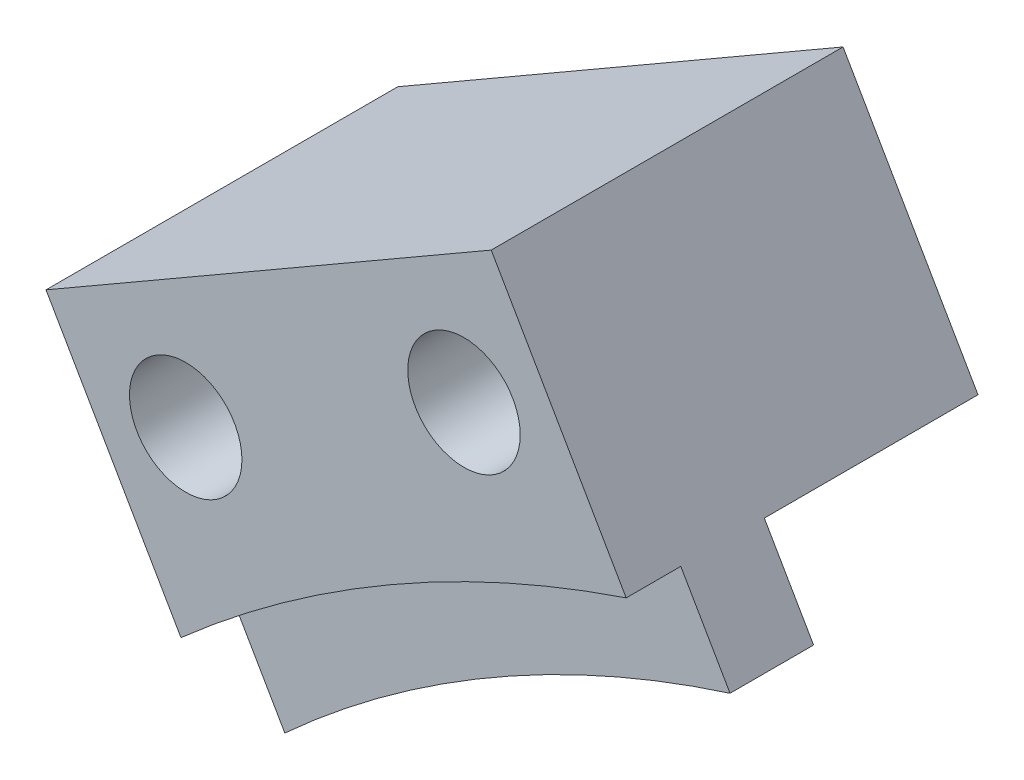
ISO-10303-21;
HEADER;
FILE_DESCRIPTION(('STEP AP214'),'2;1');
FILE_NAME('part.step','',(''),(''),'','','');
FILE_SCHEMA(('AUTOMOTIVE_DESIGN { 1 0 10303 214 1 1 1 1 }'));
ENDSEC;
DATA;
#1=APPLICATION_CONTEXT('core data for automotive mechanical design processes');
#2=APPLICATION_PROTOCOL_DEFINITION('international standard','automotive_design',2000,#1);
#3=PRODUCT_CONTEXT('',#1,'mechanical');
#4=PRODUCT('Part','Part','',(#3));
#5=PRODUCT_RELATED_PRODUCT_CATEGORY('part','',(#4));
#6=PRODUCT_DEFINITION_FORMATION('','',#4);
#7=PRODUCT_DEFINITION_CONTEXT('part definition',#1,'design');
#8=PRODUCT_DEFINITION('design','',#6,#7);
#9=PRODUCT_DEFINITION_SHAPE('','',#8);
#10=(LENGTH_UNIT() NAMED_UNIT(*) SI_UNIT(.MILLI.,.METRE.));
#11=(NAMED_UNIT(*) PLANE_ANGLE_UNIT() SI_UNIT($,.RADIAN.));
#12=(NAMED_UNIT(*) SI_UNIT($,.STERADIAN.) SOLID_ANGLE_UNIT());
#13=UNCERTAINTY_MEASURE_WITH_UNIT(LENGTH_MEASURE(1.E-05),#10,'distance_accuracy_value','');
#14=(GEOMETRIC_REPRESENTATION_CONTEXT(3) GLOBAL_UNCERTAINTY_ASSIGNED_CONTEXT((#13)) GLOBAL_UNIT_ASSIGNED_CONTEXT((#10,
#11,#12)) REPRESENTATION_CONTEXT('',''));
#15=CARTESIAN_POINT('',(0.,0.,0.));
#16=DIRECTION('',(0.,0.,1.));
#17=DIRECTION('',(1.,0.,0.));
#18=AXIS2_PLACEMENT_3D('',#15,#16,#17);
#19=CARTESIAN_POINT('',(-26.58012701892,36.038130468408,46.));
#20=DIRECTION('',(0.,0.,1.));
#21=DIRECTION('',(-0.50000000000019,0.866025403784329,0.));
#22=AXIS2_PLACEMENT_3D('',#19,#20,#21);
#23=CYLINDRICAL_SURFACE('',#22,1.75);
#24=DIRECTION('',(0.,0.,1.));
#25=VECTOR('',#24,1.);
#26=CARTESIAN_POINT('',(-27.45512701892,37.55367492503,46.));
#27=LINE('',#26,#25);
#28=CARTESIAN_POINT('',(-27.45512701892,37.55367492503,46.05));
#29=VERTEX_POINT('',#28);
#30=CARTESIAN_POINT('',(-27.45512701892,37.55367492503,57.));
#31=VERTEX_POINT('',#30);
#32=EDGE_CURVE('E10',#29,#31,#27,.T.);
#33=ORIENTED_EDGE('',*,*,#32,.F.);
#34=CARTESIAN_POINT('',(-26.58012701892,36.038130468408,46.05));
#35=DIRECTION('',(0.,0.,1.));
#36=DIRECTION('',(-0.50000000000019,0.866025403784329,0.));
#37=AXIS2_PLACEMENT_3D('',#34,#35,#36);
#38=CIRCLE('',#37,1.75);
#39=EDGE_CURVE('E166',#29,#29,#38,.T.);
#40=ORIENTED_EDGE('',*,*,#39,.F.);
#41=ORIENTED_EDGE('',*,*,#32,.T.);
#42=CARTESIAN_POINT('',(-26.58012701892,36.038130468408,57.));
#43=DIRECTION('',(0.,0.,1.));
#44=DIRECTION('',(-0.50000000000019,0.866025403784329,0.));
#45=AXIS2_PLACEMENT_3D('',#42,#43,#44);
#46=CIRCLE('',#45,1.75);
#47=EDGE_CURVE('E226',#31,#31,#46,.T.);
#48=ORIENTED_EDGE('',*,*,#47,.T.);
#49=EDGE_LOOP('',(#33,#40,#41,#48));
#50=FACE_BOUND('',#49,.T.);
#51=ADVANCED_FACE('F15',(#50),#23,.F.);
#52=CARTESIAN_POINT('',(-17.91987298107,41.038130468408,46.));
#53=DIRECTION('',(0.,0.,1.));
#54=DIRECTION('',(-0.50000000000019,0.866025403784329,0.));
#55=AXIS2_PLACEMENT_3D('',#52,#53,#54);
#56=CYLINDRICAL_SURFACE('',#55,1.75);
#57=DIRECTION('',(0.,0.,1.));
#58=VECTOR('',#57,1.);
#59=CARTESIAN_POINT('',(-18.79487298107,42.55367492503,46.));
#60=LINE('',#59,#58);
#61=CARTESIAN_POINT('',(-18.79487298107,42.55367492503,46.05));
#62=VERTEX_POINT('',#61);
#63=CARTESIAN_POINT('',(-18.79487298107,42.55367492503,57.));
#64=VERTEX_POINT('',#63);
#65=EDGE_CURVE('E24',#62,#64,#60,.T.);
#66=ORIENTED_EDGE('',*,*,#65,.F.);
#67=CARTESIAN_POINT('',(-17.91987298107,41.038130468408,46.05));
#68=DIRECTION('',(0.,0.,1.));
#69=DIRECTION('',(-0.50000000000019,0.866025403784329,0.));
#70=AXIS2_PLACEMENT_3D('',#67,#68,#69);
#71=CIRCLE('',#70,1.75);
#72=EDGE_CURVE('E171',#62,#62,#71,.T.);
#73=ORIENTED_EDGE('',*,*,#72,.F.);
#74=ORIENTED_EDGE('',*,*,#65,.T.);
#75=CARTESIAN_POINT('',(-17.91987298107,41.038130468408,57.));
#76=DIRECTION('',(0.,0.,1.));
#77=DIRECTION('',(-0.50000000000019,0.866025403784329,0.));
#78=AXIS2_PLACEMENT_3D('',#75,#76,#77);
#79=CIRCLE('',#78,1.75);
#80=EDGE_CURVE('E223',#64,#64,#79,.T.);
#81=ORIENTED_EDGE('',*,*,#80,.T.);
#82=EDGE_LOOP('',(#66,#73,#74,#81));
#83=FACE_BOUND('',#82,.T.);
#84=ADVANCED_FACE('F17',(#83),#56,.F.);
#85=CARTESIAN_POINT('',(-25.92820323027,28.908965343809,46.05));
#86=DIRECTION('',(-0.866025403784329,-0.50000000000019,0.));
#87=DIRECTION('',(-0.50000000000019,0.866025403784329,0.));
#88=AXIS2_PLACEMENT_3D('',#85,#86,#87);
#89=PLANE('',#88);
#90=DIRECTION('',(-0.50000000000019,0.866025403784329,0.));
#91=VECTOR('',#90,1.);
#92=CARTESIAN_POINT('',(-25.92820323027,28.908965343809,46.05));
#93=LINE('',#92,#91);
#94=CARTESIAN_POINT('',(-26.72820323027,30.294605989864,46.05));
#95=VERTEX_POINT('',#94);
#96=CARTESIAN_POINT('',(-30.92820323027,37.569219381653,46.05));
#97=VERTEX_POINT('',#96);
#98=EDGE_CURVE('E124',#95,#97,#93,.T.);
#99=ORIENTED_EDGE('',*,*,#98,.F.);
#100=DIRECTION('',(0.,0.,1.));
#101=VECTOR('',#100,1.);
#102=CARTESIAN_POINT('',(-26.72820323027,30.294605989864,46.));
#103=LINE('',#102,#101);
#104=CARTESIAN_POINT('',(-26.72820323027,30.294605989864,52.7));
#105=VERTEX_POINT('',#104);
#106=EDGE_CURVE('E174',#95,#105,#103,.T.);
#107=ORIENTED_EDGE('',*,*,#106,.T.);
#108=DIRECTION('',(-0.50000000000019,0.866025403784329,0.));
#109=VECTOR('',#108,1.);
#110=CARTESIAN_POINT('',(-21.92820323027,21.980762113533,52.7));
#111=LINE('',#110,#109);
#112=CARTESIAN_POINT('',(-25.19538692125,27.63969026397,52.7));
#113=VERTEX_POINT('',#112);
#114=EDGE_CURVE('E187',#113,#105,#111,.T.);
#115=ORIENTED_EDGE('',*,*,#114,.F.);
#116=DIRECTION('',(0.,0.,1.));
#117=VECTOR('',#116,1.);
#118=CARTESIAN_POINT('',(-25.19538692125,27.639690263971,51.7));
#119=LINE('',#118,#117);
#120=CARTESIAN_POINT('',(-25.19538692125,27.63969026397,55.3));
#121=VERTEX_POINT('',#120);
#122=EDGE_CURVE('E198',#113,#121,#119,.T.);
#123=ORIENTED_EDGE('',*,*,#122,.T.);
#124=DIRECTION('',(-0.50000000000019,0.866025403784329,0.));
#125=VECTOR('',#124,1.);
#126=CARTESIAN_POINT('',(-21.92820323027,21.980762113533,55.3));
#127=LINE('',#126,#125);
#128=CARTESIAN_POINT('',(-26.72820323027,30.294605989864,55.3));
#129=VERTEX_POINT('',#128);
#130=EDGE_CURVE('E206',#121,#129,#127,.T.);
#131=ORIENTED_EDGE('',*,*,#130,.T.);
#132=DIRECTION('',(0.,0.,1.));
#133=VECTOR('',#132,1.);
#134=CARTESIAN_POINT('',(-26.72820323027,30.294605989864,46.));
#135=LINE('',#134,#133);
#136=CARTESIAN_POINT('',(-26.72820323027,30.294605989864,57.));
#137=VERTEX_POINT('',#136);
#138=EDGE_CURVE('E213',#129,#137,#135,.T.);
#139=ORIENTED_EDGE('',*,*,#138,.T.);
#140=DIRECTION('',(-0.50000000000019,0.866025403784329,0.));
#141=VECTOR('',#140,1.);
#142=CARTESIAN_POINT('',(-25.92820323027,28.908965343809,57.));
#143=LINE('',#142,#141);
#144=CARTESIAN_POINT('',(-30.92820323027,37.569219381653,57.));
#145=VERTEX_POINT('',#144);
#146=EDGE_CURVE('E217',#137,#145,#143,.T.);
#147=ORIENTED_EDGE('',*,*,#146,.T.);
#148=DIRECTION('',(0.,0.,1.));
#149=VECTOR('',#148,1.);
#150=CARTESIAN_POINT('',(-30.92820323027,37.569219381653,46.05));
#151=LINE('',#150,#149);
#152=EDGE_CURVE('E229',#97,#145,#151,.T.);
#153=ORIENTED_EDGE('',*,*,#152,.F.);
#154=EDGE_LOOP('',(#99,#107,#115,#123,#131,#139,#147,#153));
#155=FACE_BOUND('',#154,.T.);
#156=ADVANCED_FACE('F313',(#155),#89,.T.);
#157=CARTESIAN_POINT('',(-17.07179676972,45.569219381653,46.05));
#158=DIRECTION('',(-0.50000000000019,0.866025403784329,0.));
#159=DIRECTION('',(0.,0.,1.));
#160=AXIS2_PLACEMENT_3D('',#157,#158,#159);
#161=PLANE('',#160);
#162=DIRECTION('',(0.,0.,1.));
#163=VECTOR('',#162,1.);
#164=CARTESIAN_POINT('',(-17.07179676972,45.569219381653,46.05));
#165=LINE('',#164,#163);
#166=CARTESIAN_POINT('',(-17.07179676972,45.569219381653,46.05));
#167=VERTEX_POINT('',#166);
#168=CARTESIAN_POINT('',(-17.07179676972,45.569219381653,57.));
#169=VERTEX_POINT('',#168);
#170=EDGE_CURVE('E134',#167,#169,#165,.T.);
#171=ORIENTED_EDGE('',*,*,#170,.F.);
#172=DIRECTION('',(-0.866025403784329,-0.50000000000019,0.));
#173=VECTOR('',#172,1.);
#174=CARTESIAN_POINT('',(-17.07179676972,45.569219381653,46.05));
#175=LINE('',#174,#173);
#176=EDGE_CURVE('E117',#167,#97,#175,.T.);
#177=ORIENTED_EDGE('',*,*,#176,.T.);
#178=ORIENTED_EDGE('',*,*,#152,.T.);
#179=DIRECTION('',(-0.866025403784329,-0.50000000000019,0.));
#180=VECTOR('',#179,1.);
#181=CARTESIAN_POINT('',(-17.07179676972,45.569219381653,57.));
#182=LINE('',#181,#180);
#183=EDGE_CURVE('E142',#169,#145,#182,.T.);
#184=ORIENTED_EDGE('',*,*,#183,.F.);
#185=EDGE_LOOP('',(#171,#177,#178,#184));
#186=FACE_BOUND('',#185,.T.);
#187=ADVANCED_FACE('F140',(#186),#161,.T.);
#188=CARTESIAN_POINT('',(-12.07179676972,36.908965343809,57.));
#189=DIRECTION('',(0.,0.,1.));
#190=DIRECTION('',(1.,0.,0.));
#191=AXIS2_PLACEMENT_3D('',#188,#189,#190);
#192=PLANE('',#191);
#193=ORIENTED_EDGE('',*,*,#47,.F.);
#194=EDGE_LOOP('',(#193));
#195=FACE_BOUND('',#194,.T.);
#196=ORIENTED_EDGE('',*,*,#80,.F.);
#197=EDGE_LOOP('',(#196));
#198=FACE_BOUND('',#197,.T.);
#199=ORIENTED_EDGE('',*,*,#146,.F.);
#200=CARTESIAN_POINT('',(0.,0.,57.));
#201=DIRECTION('',(0.,0.,-1.));
#202=DIRECTION('',(-0.661589188867901,0.749866484897887,0.));
#203=AXIS2_PLACEMENT_3D('',#200,#201,#202);
#204=CIRCLE('',#203,40.4);
#205=CARTESIAN_POINT('',(-12.87179676972,38.294605989864,57.));
#206=VERTEX_POINT('',#205);
#207=EDGE_CURVE('E210',#137,#206,#204,.T.);
#208=ORIENTED_EDGE('',*,*,#207,.T.);
#209=DIRECTION('',(-0.50000000000019,0.866025403784329,0.));
#210=VECTOR('',#209,1.);
#211=CARTESIAN_POINT('',(-12.07179676972,36.908965343809,57.));
#212=LINE('',#211,#210);
#213=EDGE_CURVE('E145',#206,#169,#212,.T.);
#214=ORIENTED_EDGE('',*,*,#213,.T.);
#215=ORIENTED_EDGE('',*,*,#183,.T.);
#216=EDGE_LOOP('',(#199,#208,#214,#215));
#217=FACE_BOUND('',#216,.T.);
#218=ADVANCED_FACE('F253',(#195,#198,#217),#192,.T.);
#219=CARTESIAN_POINT('',(0.,0.,46.));
#220=DIRECTION('',(0.,0.,1.));
#221=DIRECTION('',(-0.50000000000019,0.866025403784329,0.));
#222=AXIS2_PLACEMENT_3D('',#219,#220,#221);
#223=CYLINDRICAL_SURFACE('',#222,40.4);
#224=ORIENTED_EDGE('',*,*,#207,.F.);
#225=ORIENTED_EDGE('',*,*,#138,.F.);
#226=CARTESIAN_POINT('',(0.,0.,55.3));
#227=DIRECTION('',(0.,0.,1.));
#228=DIRECTION('',(-0.50000000000019,0.866025403784329,0.));
#229=AXIS2_PLACEMENT_3D('',#226,#227,#228);
#230=CIRCLE('',#229,40.4);
#231=CARTESIAN_POINT('',(-12.87179676972,38.294605989864,55.3));
#232=VERTEX_POINT('',#231);
#233=EDGE_CURVE('E202',#232,#129,#230,.T.);
#234=ORIENTED_EDGE('',*,*,#233,.F.);
#235=DIRECTION('',(0.,0.,1.));
#236=VECTOR('',#235,1.);
#237=CARTESIAN_POINT('',(-12.87179676972,38.294605989864,46.));
#238=LINE('',#237,#236);
#239=EDGE_CURVE('E150',#232,#206,#238,.T.);
#240=ORIENTED_EDGE('',*,*,#239,.T.);
#241=EDGE_LOOP('',(#224,#225,#234,#240));
#242=FACE_BOUND('',#241,.T.);
#243=ADVANCED_FACE('F247',(#242),#223,.F.);
#244=CARTESIAN_POINT('',(0.,0.,55.3));
#245=DIRECTION('',(0.,0.,1.));
#246=DIRECTION('',(1.,0.,0.));
#247=AXIS2_PLACEMENT_3D('',#244,#245,#246);
#248=PLANE('',#247);
#249=DIRECTION('',(-0.50000000000019,0.866025403784329,0.));
#250=VECTOR('',#249,1.);
#251=CARTESIAN_POINT('',(-8.071796769724,29.980762113533,55.3));
#252=LINE('',#251,#250);
#253=CARTESIAN_POINT('',(-11.3389804607,35.639690263971,55.3));
#254=VERTEX_POINT('',#253);
#255=EDGE_CURVE('E153',#254,#232,#252,.T.);
#256=ORIENTED_EDGE('',*,*,#255,.T.);
#257=ORIENTED_EDGE('',*,*,#233,.T.);
#258=ORIENTED_EDGE('',*,*,#130,.F.);
#259=CARTESIAN_POINT('',(0.,0.,55.3));
#260=DIRECTION('',(0.,0.,-1.));
#261=DIRECTION('',(-0.673673447092209,0.73902915144323,0.));
#262=AXIS2_PLACEMENT_3D('',#259,#260,#261);
#263=CIRCLE('',#262,37.4);
#264=EDGE_CURVE('E195',#121,#254,#263,.T.);
#265=ORIENTED_EDGE('',*,*,#264,.T.);
#266=EDGE_LOOP('',(#256,#257,#258,#265));
#267=FACE_BOUND('',#266,.T.);
#268=ADVANCED_FACE('F252',(#267),#248,.T.);
#269=CARTESIAN_POINT('',(0.,0.,51.7));
#270=DIRECTION('',(0.,0.,1.));
#271=DIRECTION('',(-0.50000000000019,0.866025403784329,0.));
#272=AXIS2_PLACEMENT_3D('',#269,#270,#271);
#273=CYLINDRICAL_SURFACE('',#272,37.4);
#274=DIRECTION('',(0.,0.,1.));
#275=VECTOR('',#274,1.);
#276=CARTESIAN_POINT('',(-11.3389804607,35.639690263971,51.7));
#277=LINE('',#276,#275);
#278=CARTESIAN_POINT('',(-11.3389804607,35.639690263971,52.7));
#279=VERTEX_POINT('',#278);
#280=EDGE_CURVE('E156',#279,#254,#277,.T.);
#281=ORIENTED_EDGE('',*,*,#280,.T.);
#282=ORIENTED_EDGE('',*,*,#264,.F.);
#283=ORIENTED_EDGE('',*,*,#122,.F.);
#284=CARTESIAN_POINT('',(0.,0.,52.7));
#285=DIRECTION('',(0.,0.,1.));
#286=DIRECTION('',(-0.303181295740855,0.952932894758543,0.));
#287=AXIS2_PLACEMENT_3D('',#284,#285,#286);
#288=CIRCLE('',#287,37.4);
#289=EDGE_CURVE('E178',#279,#113,#288,.T.);
#290=ORIENTED_EDGE('',*,*,#289,.F.);
#291=EDGE_LOOP('',(#281,#282,#283,#290));
#292=FACE_BOUND('',#291,.T.);
#293=ADVANCED_FACE('F289',(#292),#273,.F.);
#294=CARTESIAN_POINT('',(0.,0.,52.7));
#295=DIRECTION('',(0.,0.,1.));
#296=DIRECTION('',(1.,0.,0.));
#297=AXIS2_PLACEMENT_3D('',#294,#295,#296);
#298=PLANE('',#297);
#299=ORIENTED_EDGE('',*,*,#289,.T.);
#300=ORIENTED_EDGE('',*,*,#114,.T.);
#301=CARTESIAN_POINT('',(0.,0.,52.7));
#302=DIRECTION('',(0.,0.,1.));
#303=DIRECTION('',(-0.50000000000019,0.866025403784329,0.));
#304=AXIS2_PLACEMENT_3D('',#301,#302,#303);
#305=CIRCLE('',#304,40.4);
#306=CARTESIAN_POINT('',(-12.87179676972,38.294605989864,52.7));
#307=VERTEX_POINT('',#306);
#308=EDGE_CURVE('E170',#307,#105,#305,.T.);
#309=ORIENTED_EDGE('',*,*,#308,.F.);
#310=DIRECTION('',(-0.50000000000019,0.866025403784329,0.));
#311=VECTOR('',#310,1.);
#312=CARTESIAN_POINT('',(-8.071796769724,29.980762113533,52.7));
#313=LINE('',#312,#311);
#314=EDGE_CURVE('E163',#279,#307,#313,.T.);
#315=ORIENTED_EDGE('',*,*,#314,.F.);
#316=EDGE_LOOP('',(#299,#300,#309,#315));
#317=FACE_BOUND('',#316,.T.);
#318=ADVANCED_FACE('F280',(#317),#298,.F.);
#319=CARTESIAN_POINT('',(0.,0.,46.));
#320=DIRECTION('',(0.,0.,1.));
#321=DIRECTION('',(-0.50000000000019,0.866025403784329,0.));
#322=AXIS2_PLACEMENT_3D('',#319,#320,#321);
#323=CYLINDRICAL_SURFACE('',#322,40.4);
#324=ORIENTED_EDGE('',*,*,#308,.T.);
#325=ORIENTED_EDGE('',*,*,#106,.F.);
#326=CARTESIAN_POINT('',(0.,0.,46.05));
#327=DIRECTION('',(0.,0.,1.));
#328=DIRECTION('',(-0.318608830933922,0.947886286877767,0.));
#329=AXIS2_PLACEMENT_3D('',#326,#327,#328);
#330=CIRCLE('',#329,40.4);
#331=CARTESIAN_POINT('',(-12.87179676972,38.294605989864,46.05));
#332=VERTEX_POINT('',#331);
#333=EDGE_CURVE('E128',#332,#95,#330,.T.);
#334=ORIENTED_EDGE('',*,*,#333,.F.);
#335=DIRECTION('',(0.,0.,1.));
#336=VECTOR('',#335,1.);
#337=CARTESIAN_POINT('',(-12.87179676972,38.294605989864,46.));
#338=LINE('',#337,#336);
#339=EDGE_CURVE('E137',#332,#307,#338,.T.);
#340=ORIENTED_EDGE('',*,*,#339,.T.);
#341=EDGE_LOOP('',(#324,#325,#334,#340));
#342=FACE_BOUND('',#341,.T.);
#343=ADVANCED_FACE('F264',(#342),#323,.F.);
#344=CARTESIAN_POINT('',(-12.07179676972,36.908965343809,46.05));
#345=DIRECTION('',(0.,0.,1.));
#346=DIRECTION('',(1.,0.,0.));
#347=AXIS2_PLACEMENT_3D('',#344,#345,#346);
#348=PLANE('',#347);
#349=ORIENTED_EDGE('',*,*,#39,.T.);
#350=EDGE_LOOP('',(#349));
#351=FACE_BOUND('',#350,.T.);
#352=ORIENTED_EDGE('',*,*,#72,.T.);
#353=EDGE_LOOP('',(#352));
#354=FACE_BOUND('',#353,.T.);
#355=ORIENTED_EDGE('',*,*,#176,.F.);
#356=DIRECTION('',(-0.50000000000019,0.866025403784329,0.));
#357=VECTOR('',#356,1.);
#358=CARTESIAN_POINT('',(-12.07179676972,36.908965343809,46.05));
#359=LINE('',#358,#357);
#360=EDGE_CURVE('E121',#332,#167,#359,.T.);
#361=ORIENTED_EDGE('',*,*,#360,.F.);
#362=ORIENTED_EDGE('',*,*,#333,.T.);
#363=ORIENTED_EDGE('',*,*,#98,.T.);
#364=EDGE_LOOP('',(#355,#361,#362,#363));
#365=FACE_BOUND('',#364,.T.);
#366=ADVANCED_FACE('F119',(#351,#354,#365),#348,.F.);
#367=CARTESIAN_POINT('',(-12.07179676972,36.908965343809,46.05));
#368=DIRECTION('',(-0.866025403784329,-0.50000000000019,0.));
#369=DIRECTION('',(-0.50000000000019,0.866025403784329,0.));
#370=AXIS2_PLACEMENT_3D('',#367,#368,#369);
#371=PLANE('',#370);
#372=ORIENTED_EDGE('',*,*,#170,.T.);
#373=ORIENTED_EDGE('',*,*,#213,.F.);
#374=ORIENTED_EDGE('',*,*,#239,.F.);
#375=ORIENTED_EDGE('',*,*,#255,.F.);
#376=ORIENTED_EDGE('',*,*,#280,.F.);
#377=ORIENTED_EDGE('',*,*,#314,.T.);
#378=ORIENTED_EDGE('',*,*,#339,.F.);
#379=ORIENTED_EDGE('',*,*,#360,.T.);
#380=EDGE_LOOP('',(#372,#373,#374,#375,#376,#377,#378,#379));
#381=FACE_BOUND('',#380,.T.);
#382=ADVANCED_FACE('F132',(#381),#371,.F.);
#383=CLOSED_SHELL('',(#51,#84,#156,#187,#218,#243,#268,#293,#318,#343,#366,#382));
#384=MANIFOLD_SOLID_BREP('B1',#383);
#385=ADVANCED_BREP_SHAPE_REPRESENTATION('',(#18,#384),#14);
#386=SHAPE_DEFINITION_REPRESENTATION(#9,#385);
ENDSEC;
END-ISO-10303-21;
